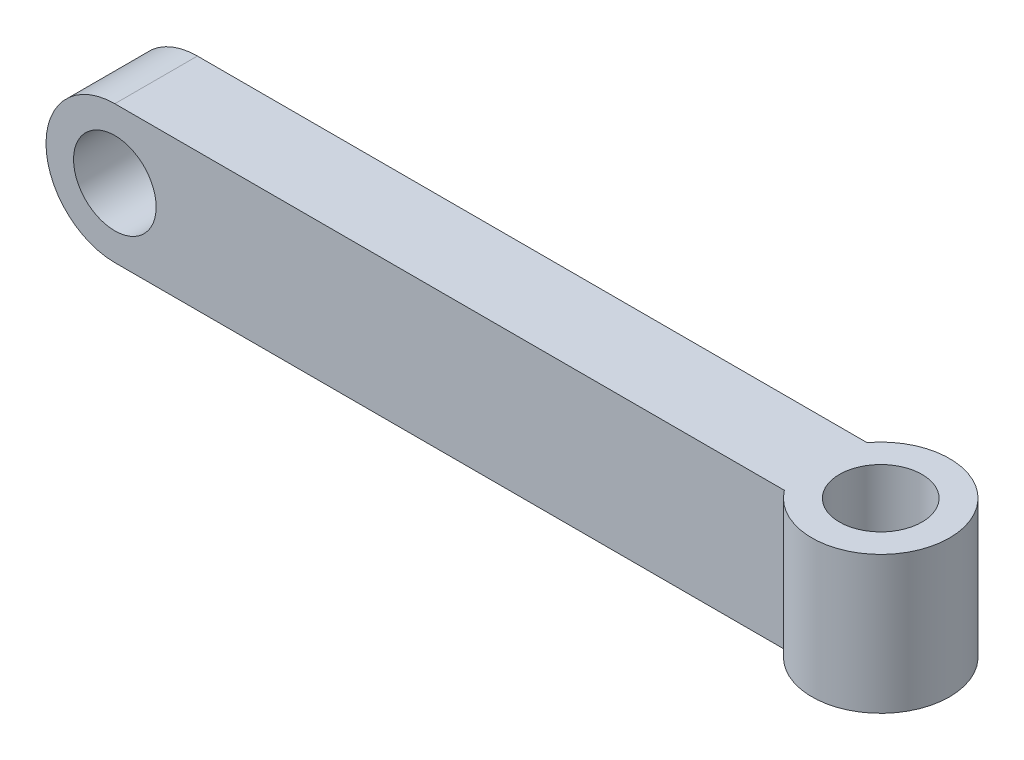
ISO-10303-21;
HEADER;
FILE_DESCRIPTION(('STEP AP214'),'2;1');
FILE_NAME('part.step','',(''),(''),'','','');
FILE_SCHEMA(('AUTOMOTIVE_DESIGN { 1 0 10303 214 1 1 1 1 }'));
ENDSEC;
DATA;
#1=APPLICATION_CONTEXT('core data for automotive mechanical design processes');
#2=APPLICATION_PROTOCOL_DEFINITION('international standard','automotive_design',2000,#1);
#3=PRODUCT_CONTEXT('',#1,'mechanical');
#4=PRODUCT('Part','Part','',(#3));
#5=PRODUCT_RELATED_PRODUCT_CATEGORY('part','',(#4));
#6=PRODUCT_DEFINITION_FORMATION('','',#4);
#7=PRODUCT_DEFINITION_CONTEXT('part definition',#1,'design');
#8=PRODUCT_DEFINITION('design','',#6,#7);
#9=PRODUCT_DEFINITION_SHAPE('','',#8);
#10=(LENGTH_UNIT() NAMED_UNIT(*) SI_UNIT(.MILLI.,.METRE.));
#11=(NAMED_UNIT(*) PLANE_ANGLE_UNIT() SI_UNIT($,.RADIAN.));
#12=(NAMED_UNIT(*) SI_UNIT($,.STERADIAN.) SOLID_ANGLE_UNIT());
#13=UNCERTAINTY_MEASURE_WITH_UNIT(LENGTH_MEASURE(1.E-05),#10,'distance_accuracy_value','');
#14=(GEOMETRIC_REPRESENTATION_CONTEXT(3) GLOBAL_UNCERTAINTY_ASSIGNED_CONTEXT((#13)) GLOBAL_UNIT_ASSIGNED_CONTEXT((#10,
#11,#12)) REPRESENTATION_CONTEXT('',''));
#15=CARTESIAN_POINT('',(0.,0.,0.));
#16=DIRECTION('',(0.,0.,1.));
#17=DIRECTION('',(1.,0.,0.));
#18=AXIS2_PLACEMENT_3D('',#15,#16,#17);
#19=CARTESIAN_POINT('',(-31.32,-5.,10.));
#20=DIRECTION('',(0.,1.,0.));
#21=DIRECTION('',(0.,0.,1.));
#22=AXIS2_PLACEMENT_3D('',#19,#20,#21);
#23=PLANE('',#22);
#24=CARTESIAN_POINT('',(26.32,-5.,5.));
#25=DIRECTION('',(0.,1.,0.));
#26=DIRECTION('',(0.,0.,1.));
#27=AXIS2_PLACEMENT_3D('',#24,#25,#26);
#28=CIRCLE('',#27,3.);
#29=CARTESIAN_POINT('',(26.32,-5.,8.));
#30=VERTEX_POINT('',#29);
#31=EDGE_CURVE('E202',#30,#30,#28,.T.);
#32=ORIENTED_EDGE('',*,*,#31,.T.);
#33=EDGE_LOOP('',(#32));
#34=FACE_BOUND('',#33,.T.);
#35=DIRECTION('',(-1.,0.,0.));
#36=VECTOR('',#35,1.);
#37=CARTESIAN_POINT('',(0.,-5.,8.));
#38=LINE('',#37,#36);
#39=CARTESIAN_POINT('',(22.32,-5.,8.));
#40=VERTEX_POINT('',#39);
#41=CARTESIAN_POINT('',(-26.32,-5.,8.00000000000001));
#42=VERTEX_POINT('',#41);
#43=EDGE_CURVE('E166',#40,#42,#38,.T.);
#44=ORIENTED_EDGE('',*,*,#43,.T.);
#45=DIRECTION('',(0.,0.,1.));
#46=VECTOR('',#45,1.);
#47=CARTESIAN_POINT('',(-26.32,-5.,0.));
#48=LINE('',#47,#46);
#49=CARTESIAN_POINT('',(-26.32,-5.,1.99999999999999));
#50=VERTEX_POINT('',#49);
#51=EDGE_CURVE('E169',#50,#42,#48,.T.);
#52=ORIENTED_EDGE('',*,*,#51,.F.);
#53=DIRECTION('',(-1.,0.,0.));
#54=VECTOR('',#53,1.);
#55=CARTESIAN_POINT('',(0.,-5.,2.));
#56=LINE('',#55,#54);
#57=CARTESIAN_POINT('',(22.32,-5.,2.));
#58=VERTEX_POINT('',#57);
#59=EDGE_CURVE('E198',#58,#50,#56,.T.);
#60=ORIENTED_EDGE('',*,*,#59,.F.);
#61=CARTESIAN_POINT('',(26.32,-5.,5.));
#62=DIRECTION('',(0.,1.,0.));
#63=DIRECTION('',(0.,0.,1.));
#64=AXIS2_PLACEMENT_3D('',#61,#62,#63);
#65=CIRCLE('',#64,5.);
#66=EDGE_CURVE('E134',#40,#58,#65,.T.);
#67=ORIENTED_EDGE('',*,*,#66,.F.);
#68=EDGE_LOOP('',(#44,#52,#60,#67));
#69=FACE_BOUND('',#68,.T.);
#70=ADVANCED_FACE('F127',(#34,#69),#23,.F.);
#71=CARTESIAN_POINT('',(-31.32,5.,10.));
#72=DIRECTION('',(0.,-1.,0.));
#73=DIRECTION('',(0.,0.,-1.));
#74=AXIS2_PLACEMENT_3D('',#71,#72,#73);
#75=PLANE('',#74);
#76=CARTESIAN_POINT('',(26.32,5.,5.));
#77=DIRECTION('',(0.,1.,0.));
#78=DIRECTION('',(0.,0.,1.));
#79=AXIS2_PLACEMENT_3D('',#76,#77,#78);
#80=CIRCLE('',#79,3.);
#81=CARTESIAN_POINT('',(26.32,5.,8.));
#82=VERTEX_POINT('',#81);
#83=EDGE_CURVE('E205',#82,#82,#80,.T.);
#84=ORIENTED_EDGE('',*,*,#83,.F.);
#85=EDGE_LOOP('',(#84));
#86=FACE_BOUND('',#85,.T.);
#87=DIRECTION('',(0.,0.,1.));
#88=VECTOR('',#87,1.);
#89=CARTESIAN_POINT('',(-26.32,5.,0.));
#90=LINE('',#89,#88);
#91=CARTESIAN_POINT('',(-26.32,5.,1.99999999999999));
#92=VERTEX_POINT('',#91);
#93=CARTESIAN_POINT('',(-26.32,5.,8.00000000000001));
#94=VERTEX_POINT('',#93);
#95=EDGE_CURVE('E186',#92,#94,#90,.T.);
#96=ORIENTED_EDGE('',*,*,#95,.T.);
#97=DIRECTION('',(-1.,0.,0.));
#98=VECTOR('',#97,1.);
#99=CARTESIAN_POINT('',(0.,5.,8.));
#100=LINE('',#99,#98);
#101=CARTESIAN_POINT('',(22.32,5.,8.));
#102=VERTEX_POINT('',#101);
#103=EDGE_CURVE('E171',#102,#94,#100,.T.);
#104=ORIENTED_EDGE('',*,*,#103,.F.);
#105=CARTESIAN_POINT('',(26.32,5.,5.));
#106=DIRECTION('',(0.,1.,0.));
#107=DIRECTION('',(0.,0.,1.));
#108=AXIS2_PLACEMENT_3D('',#105,#106,#107);
#109=CIRCLE('',#108,5.);
#110=CARTESIAN_POINT('',(22.32,5.,2.));
#111=VERTEX_POINT('',#110);
#112=EDGE_CURVE('E141',#102,#111,#109,.T.);
#113=ORIENTED_EDGE('',*,*,#112,.T.);
#114=DIRECTION('',(-1.,0.,0.));
#115=VECTOR('',#114,1.);
#116=CARTESIAN_POINT('',(0.,5.,2.));
#117=LINE('',#116,#115);
#118=EDGE_CURVE('E190',#111,#92,#117,.T.);
#119=ORIENTED_EDGE('',*,*,#118,.T.);
#120=EDGE_LOOP('',(#96,#104,#113,#119));
#121=FACE_BOUND('',#120,.T.);
#122=ADVANCED_FACE('F230',(#86,#121),#75,.F.);
#123=CARTESIAN_POINT('',(26.32,-5.,5.));
#124=DIRECTION('',(0.,1.,0.));
#125=DIRECTION('',(0.,0.,1.));
#126=AXIS2_PLACEMENT_3D('',#123,#124,#125);
#127=CYLINDRICAL_SURFACE('',#126,5.);
#128=ORIENTED_EDGE('',*,*,#112,.F.);
#129=DIRECTION('',(0.,1.,0.));
#130=VECTOR('',#129,1.);
#131=CARTESIAN_POINT('',(22.32,-5.,8.));
#132=LINE('',#131,#130);
#133=EDGE_CURVE('E12',#40,#102,#132,.T.);
#134=ORIENTED_EDGE('',*,*,#133,.F.);
#135=ORIENTED_EDGE('',*,*,#66,.T.);
#136=DIRECTION('',(0.,1.,0.));
#137=VECTOR('',#136,1.);
#138=CARTESIAN_POINT('',(22.32,-5.,2.));
#139=LINE('',#138,#137);
#140=EDGE_CURVE('E197',#58,#111,#139,.T.);
#141=ORIENTED_EDGE('',*,*,#140,.T.);
#142=EDGE_LOOP('',(#128,#134,#135,#141));
#143=FACE_BOUND('',#142,.T.);
#144=ADVANCED_FACE('F195',(#143),#127,.T.);
#145=CARTESIAN_POINT('',(-26.32,0.,0.));
#146=DIRECTION('',(0.,0.,1.));
#147=DIRECTION('',(1.,0.,0.));
#148=AXIS2_PLACEMENT_3D('',#145,#146,#147);
#149=CYLINDRICAL_SURFACE('',#148,5.);
#150=CARTESIAN_POINT('',(-26.32,0.,8.00000000000001));
#151=DIRECTION('',(0.,0.,-1.));
#152=DIRECTION('',(-1.,0.,0.));
#153=AXIS2_PLACEMENT_3D('',#150,#151,#152);
#154=CIRCLE('',#153,5.);
#155=EDGE_CURVE('E174',#94,#42,#154,.F.);
#156=ORIENTED_EDGE('',*,*,#155,.F.);
#157=ORIENTED_EDGE('',*,*,#95,.F.);
#158=CARTESIAN_POINT('',(-26.32,0.,1.99999999999999));
#159=DIRECTION('',(0.,0.,1.));
#160=DIRECTION('',(1.,0.,0.));
#161=AXIS2_PLACEMENT_3D('',#158,#159,#160);
#162=CIRCLE('',#161,5.);
#163=EDGE_CURVE('E185',#50,#92,#162,.F.);
#164=ORIENTED_EDGE('',*,*,#163,.F.);
#165=ORIENTED_EDGE('',*,*,#51,.T.);
#166=EDGE_LOOP('',(#156,#157,#164,#165));
#167=FACE_BOUND('',#166,.T.);
#168=ADVANCED_FACE('F184',(#167),#149,.T.);
#169=CARTESIAN_POINT('',(0.,-5.,2.));
#170=DIRECTION('',(0.,0.,-1.));
#171=DIRECTION('',(-1.,0.,0.));
#172=AXIS2_PLACEMENT_3D('',#169,#170,#171);
#173=PLANE('',#172);
#174=ORIENTED_EDGE('',*,*,#140,.F.);
#175=ORIENTED_EDGE('',*,*,#59,.T.);
#176=ORIENTED_EDGE('',*,*,#163,.T.);
#177=ORIENTED_EDGE('',*,*,#118,.F.);
#178=EDGE_LOOP('',(#174,#175,#176,#177));
#179=FACE_BOUND('',#178,.T.);
#180=CARTESIAN_POINT('',(-26.32,0.,1.99999999999999));
#181=DIRECTION('',(0.,0.,1.));
#182=DIRECTION('',(1.,0.,0.));
#183=AXIS2_PLACEMENT_3D('',#180,#181,#182);
#184=CIRCLE('',#183,3.);
#185=CARTESIAN_POINT('',(-23.32,0.,1.99999999999999));
#186=VERTEX_POINT('',#185);
#187=EDGE_CURVE('E180',#186,#186,#184,.F.);
#188=ORIENTED_EDGE('',*,*,#187,.F.);
#189=EDGE_LOOP('',(#188));
#190=FACE_BOUND('',#189,.T.);
#191=ADVANCED_FACE('F200',(#179,#190),#173,.T.);
#192=CARTESIAN_POINT('',(0.,-5.,8.));
#193=DIRECTION('',(0.,0.,-1.));
#194=DIRECTION('',(-1.,0.,0.));
#195=AXIS2_PLACEMENT_3D('',#192,#193,#194);
#196=PLANE('',#195);
#197=ORIENTED_EDGE('',*,*,#43,.F.);
#198=ORIENTED_EDGE('',*,*,#133,.T.);
#199=ORIENTED_EDGE('',*,*,#103,.T.);
#200=ORIENTED_EDGE('',*,*,#155,.T.);
#201=EDGE_LOOP('',(#197,#198,#199,#200));
#202=FACE_BOUND('',#201,.T.);
#203=CARTESIAN_POINT('',(-26.32,0.,8.00000000000001));
#204=DIRECTION('',(0.,0.,-1.));
#205=DIRECTION('',(-1.,0.,0.));
#206=AXIS2_PLACEMENT_3D('',#203,#204,#205);
#207=CIRCLE('',#206,3.);
#208=CARTESIAN_POINT('',(-29.32,0.,8.00000000000001));
#209=VERTEX_POINT('',#208);
#210=EDGE_CURVE('E181',#209,#209,#207,.F.);
#211=ORIENTED_EDGE('',*,*,#210,.F.);
#212=EDGE_LOOP('',(#211));
#213=FACE_BOUND('',#212,.T.);
#214=ADVANCED_FACE('F175',(#202,#213),#196,.F.);
#215=CARTESIAN_POINT('',(26.32,-5.,5.));
#216=DIRECTION('',(0.,1.,0.));
#217=DIRECTION('',(0.,0.,1.));
#218=AXIS2_PLACEMENT_3D('',#215,#216,#217);
#219=CYLINDRICAL_SURFACE('',#218,3.);
#220=ORIENTED_EDGE('',*,*,#31,.F.);
#221=EDGE_LOOP('',(#220));
#222=FACE_BOUND('',#221,.T.);
#223=ORIENTED_EDGE('',*,*,#83,.T.);
#224=EDGE_LOOP('',(#223));
#225=FACE_BOUND('',#224,.T.);
#226=ADVANCED_FACE('F220',(#222,#225),#219,.F.);
#227=CARTESIAN_POINT('',(-26.32,0.,0.));
#228=DIRECTION('',(0.,0.,1.));
#229=DIRECTION('',(1.,0.,0.));
#230=AXIS2_PLACEMENT_3D('',#227,#228,#229);
#231=CYLINDRICAL_SURFACE('',#230,3.);
#232=ORIENTED_EDGE('',*,*,#210,.T.);
#233=EDGE_LOOP('',(#232));
#234=FACE_BOUND('',#233,.T.);
#235=ORIENTED_EDGE('',*,*,#187,.T.);
#236=EDGE_LOOP('',(#235));
#237=FACE_BOUND('',#236,.T.);
#238=ADVANCED_FACE('F217',(#234,#237),#231,.F.);
#239=CLOSED_SHELL('',(#70,#122,#144,#168,#191,#214,#226,#238));
#240=MANIFOLD_SOLID_BREP('B2',#239);
#241=ADVANCED_BREP_SHAPE_REPRESENTATION('',(#18,#240),#14);
#242=SHAPE_DEFINITION_REPRESENTATION(#9,#241);
ENDSEC;
END-ISO-10303-21;
